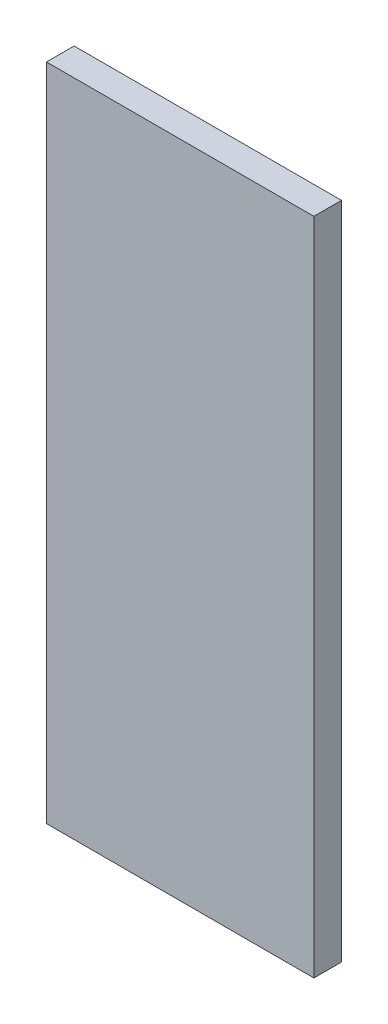
ISO-10303-21;
HEADER;
FILE_DESCRIPTION(('STEP AP214'),'2;1');
FILE_NAME('part.step','',(''),(''),'','','');
FILE_SCHEMA(('AUTOMOTIVE_DESIGN { 1 0 10303 214 1 1 1 1 }'));
ENDSEC;
DATA;
#1=APPLICATION_CONTEXT('core data for automotive mechanical design processes');
#2=APPLICATION_PROTOCOL_DEFINITION('international standard','automotive_design',2000,#1);
#3=PRODUCT_CONTEXT('',#1,'mechanical');
#4=PRODUCT('Part','Part','',(#3));
#5=PRODUCT_RELATED_PRODUCT_CATEGORY('part','',(#4));
#6=PRODUCT_DEFINITION_FORMATION('','',#4);
#7=PRODUCT_DEFINITION_CONTEXT('part definition',#1,'design');
#8=PRODUCT_DEFINITION('design','',#6,#7);
#9=PRODUCT_DEFINITION_SHAPE('','',#8);
#10=(LENGTH_UNIT() NAMED_UNIT(*) SI_UNIT(.MILLI.,.METRE.));
#11=(NAMED_UNIT(*) PLANE_ANGLE_UNIT() SI_UNIT($,.RADIAN.));
#12=(NAMED_UNIT(*) SI_UNIT($,.STERADIAN.) SOLID_ANGLE_UNIT());
#13=UNCERTAINTY_MEASURE_WITH_UNIT(LENGTH_MEASURE(1.E-05),#10,'distance_accuracy_value','');
#14=(GEOMETRIC_REPRESENTATION_CONTEXT(3) GLOBAL_UNCERTAINTY_ASSIGNED_CONTEXT((#13)) GLOBAL_UNIT_ASSIGNED_CONTEXT((#10,
#11,#12)) REPRESENTATION_CONTEXT('',''));
#15=CARTESIAN_POINT('',(0.,0.,0.));
#16=DIRECTION('',(0.,0.,1.));
#17=DIRECTION('',(1.,0.,0.));
#18=AXIS2_PLACEMENT_3D('',#15,#16,#17);
#19=CARTESIAN_POINT('',(156.3,-59.7,45.));
#20=DIRECTION('',(0.,-1.,0.));
#21=DIRECTION('',(0.,0.,-1.));
#22=AXIS2_PLACEMENT_3D('',#19,#20,#21);
#23=PLANE('',#22);
#24=DIRECTION('',(1.,0.,0.));
#25=VECTOR('',#24,1.);
#26=CARTESIAN_POINT('',(156.3,-59.7,50.));
#27=LINE('',#26,#25);
#28=CARTESIAN_POINT('',(156.3,-59.7,50.));
#29=VERTEX_POINT('',#28);
#30=CARTESIAN_POINT('',(204.7,-59.7,50.));
#31=VERTEX_POINT('',#30);
#32=EDGE_CURVE('E107',#29,#31,#27,.T.);
#33=ORIENTED_EDGE('',*,*,#32,.F.);
#34=DIRECTION('',(0.,0.,1.));
#35=VECTOR('',#34,1.);
#36=CARTESIAN_POINT('',(156.3,-59.7,45.));
#37=LINE('',#36,#35);
#38=CARTESIAN_POINT('',(156.3,-59.7,45.));
#39=VERTEX_POINT('',#38);
#40=EDGE_CURVE('E11',#39,#29,#37,.T.);
#41=ORIENTED_EDGE('',*,*,#40,.F.);
#42=DIRECTION('',(1.,0.,0.));
#43=VECTOR('',#42,1.);
#44=CARTESIAN_POINT('',(156.3,-59.7,45.));
#45=LINE('',#44,#43);
#46=CARTESIAN_POINT('',(204.7,-59.7,45.));
#47=VERTEX_POINT('',#46);
#48=EDGE_CURVE('E101',#39,#47,#45,.T.);
#49=ORIENTED_EDGE('',*,*,#48,.T.);
#50=DIRECTION('',(0.,0.,1.));
#51=VECTOR('',#50,1.);
#52=CARTESIAN_POINT('',(204.7,-59.7,45.));
#53=LINE('',#52,#51);
#54=EDGE_CURVE('E46',#47,#31,#53,.T.);
#55=ORIENTED_EDGE('',*,*,#54,.T.);
#56=EDGE_LOOP('',(#33,#41,#49,#55));
#57=FACE_BOUND('',#56,.T.);
#58=ADVANCED_FACE('F43',(#57),#23,.T.);
#59=CARTESIAN_POINT('',(156.3,59.7,45.));
#60=DIRECTION('',(-1.,0.,0.));
#61=DIRECTION('',(0.,0.,1.));
#62=AXIS2_PLACEMENT_3D('',#59,#60,#61);
#63=PLANE('',#62);
#64=DIRECTION('',(0.,-1.,0.));
#65=VECTOR('',#64,1.);
#66=CARTESIAN_POINT('',(156.3,59.7,50.));
#67=LINE('',#66,#65);
#68=CARTESIAN_POINT('',(156.3,59.7,50.));
#69=VERTEX_POINT('',#68);
#70=EDGE_CURVE('E103',#69,#29,#67,.T.);
#71=ORIENTED_EDGE('',*,*,#70,.F.);
#72=DIRECTION('',(0.,0.,1.));
#73=VECTOR('',#72,1.);
#74=CARTESIAN_POINT('',(156.3,59.7,45.));
#75=LINE('',#74,#73);
#76=CARTESIAN_POINT('',(156.3,59.7,45.));
#77=VERTEX_POINT('',#76);
#78=EDGE_CURVE('E52',#77,#69,#75,.T.);
#79=ORIENTED_EDGE('',*,*,#78,.F.);
#80=DIRECTION('',(0.,-1.,0.));
#81=VECTOR('',#80,1.);
#82=CARTESIAN_POINT('',(156.3,59.7,45.));
#83=LINE('',#82,#81);
#84=EDGE_CURVE('E98',#77,#39,#83,.T.);
#85=ORIENTED_EDGE('',*,*,#84,.T.);
#86=ORIENTED_EDGE('',*,*,#40,.T.);
#87=EDGE_LOOP('',(#71,#79,#85,#86));
#88=FACE_BOUND('',#87,.T.);
#89=ADVANCED_FACE('F117',(#88),#63,.T.);
#90=CARTESIAN_POINT('',(204.7,59.7,45.));
#91=DIRECTION('',(0.,1.,0.));
#92=DIRECTION('',(0.,0.,1.));
#93=AXIS2_PLACEMENT_3D('',#90,#91,#92);
#94=PLANE('',#93);
#95=DIRECTION('',(-1.,0.,0.));
#96=VECTOR('',#95,1.);
#97=CARTESIAN_POINT('',(204.7,59.7,50.));
#98=LINE('',#97,#96);
#99=CARTESIAN_POINT('',(204.7,59.7,50.));
#100=VERTEX_POINT('',#99);
#101=EDGE_CURVE('E93',#100,#69,#98,.T.);
#102=ORIENTED_EDGE('',*,*,#101,.F.);
#103=DIRECTION('',(0.,0.,1.));
#104=VECTOR('',#103,1.);
#105=CARTESIAN_POINT('',(204.7,59.7,45.));
#106=LINE('',#105,#104);
#107=CARTESIAN_POINT('',(204.7,59.7,45.));
#108=VERTEX_POINT('',#107);
#109=EDGE_CURVE('E88',#108,#100,#106,.T.);
#110=ORIENTED_EDGE('',*,*,#109,.F.);
#111=DIRECTION('',(-1.,0.,0.));
#112=VECTOR('',#111,1.);
#113=CARTESIAN_POINT('',(204.7,59.7,45.));
#114=LINE('',#113,#112);
#115=EDGE_CURVE('E91',#108,#77,#114,.T.);
#116=ORIENTED_EDGE('',*,*,#115,.T.);
#117=ORIENTED_EDGE('',*,*,#78,.T.);
#118=EDGE_LOOP('',(#102,#110,#116,#117));
#119=FACE_BOUND('',#118,.T.);
#120=ADVANCED_FACE('F90',(#119),#94,.T.);
#121=CARTESIAN_POINT('',(204.7,-59.7,45.));
#122=DIRECTION('',(1.,0.,0.));
#123=DIRECTION('',(0.,0.,-1.));
#124=AXIS2_PLACEMENT_3D('',#121,#122,#123);
#125=PLANE('',#124);
#126=DIRECTION('',(0.,1.,0.));
#127=VECTOR('',#126,1.);
#128=CARTESIAN_POINT('',(204.7,-59.7,50.));
#129=LINE('',#128,#127);
#130=EDGE_CURVE('E110',#31,#100,#129,.T.);
#131=ORIENTED_EDGE('',*,*,#130,.F.);
#132=ORIENTED_EDGE('',*,*,#54,.F.);
#133=DIRECTION('',(0.,1.,0.));
#134=VECTOR('',#133,1.);
#135=CARTESIAN_POINT('',(204.7,-59.7,45.));
#136=LINE('',#135,#134);
#137=EDGE_CURVE('E97',#47,#108,#136,.T.);
#138=ORIENTED_EDGE('',*,*,#137,.T.);
#139=ORIENTED_EDGE('',*,*,#109,.T.);
#140=EDGE_LOOP('',(#131,#132,#138,#139));
#141=FACE_BOUND('',#140,.T.);
#142=ADVANCED_FACE('F100',(#141),#125,.T.);
#143=CARTESIAN_POINT('',(0.,0.,45.));
#144=DIRECTION('',(0.,0.,1.));
#145=DIRECTION('',(1.,0.,0.));
#146=AXIS2_PLACEMENT_3D('',#143,#144,#145);
#147=PLANE('',#146);
#148=ORIENTED_EDGE('',*,*,#48,.F.);
#149=ORIENTED_EDGE('',*,*,#84,.F.);
#150=ORIENTED_EDGE('',*,*,#115,.F.);
#151=ORIENTED_EDGE('',*,*,#137,.F.);
#152=EDGE_LOOP('',(#148,#149,#150,#151));
#153=FACE_BOUND('',#152,.T.);
#154=ADVANCED_FACE('F96',(#153),#147,.F.);
#155=CARTESIAN_POINT('',(0.,0.,50.));
#156=DIRECTION('',(0.,0.,1.));
#157=DIRECTION('',(1.,0.,0.));
#158=AXIS2_PLACEMENT_3D('',#155,#156,#157);
#159=PLANE('',#158);
#160=ORIENTED_EDGE('',*,*,#32,.T.);
#161=ORIENTED_EDGE('',*,*,#130,.T.);
#162=ORIENTED_EDGE('',*,*,#101,.T.);
#163=ORIENTED_EDGE('',*,*,#70,.T.);
#164=EDGE_LOOP('',(#160,#161,#162,#163));
#165=FACE_BOUND('',#164,.T.);
#166=ADVANCED_FACE('F116',(#165),#159,.T.);
#167=CLOSED_SHELL('',(#58,#89,#120,#142,#154,#166));
#168=MANIFOLD_SOLID_BREP('B2',#167);
#169=ADVANCED_BREP_SHAPE_REPRESENTATION('',(#18,#168),#14);
#170=SHAPE_DEFINITION_REPRESENTATION(#9,#169);
ENDSEC;
END-ISO-10303-21;
